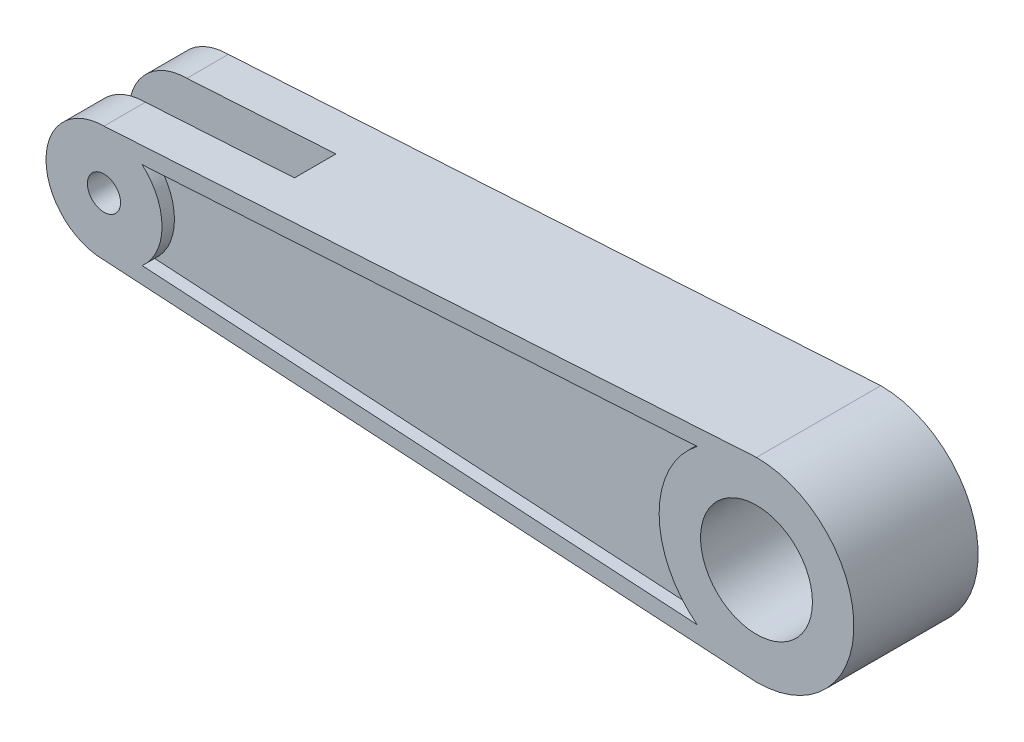
ISO-10303-21;
HEADER;
FILE_DESCRIPTION(('STEP AP214'),'2;1');
FILE_NAME('part.step','',(''),(''),'','','');
FILE_SCHEMA(('AUTOMOTIVE_DESIGN { 1 0 10303 214 1 1 1 1 }'));
ENDSEC;
DATA;
#1=APPLICATION_CONTEXT('core data for automotive mechanical design processes');
#2=APPLICATION_PROTOCOL_DEFINITION('international standard','automotive_design',2000,#1);
#3=PRODUCT_CONTEXT('',#1,'mechanical');
#4=PRODUCT('Part','Part','',(#3));
#5=PRODUCT_RELATED_PRODUCT_CATEGORY('part','',(#4));
#6=PRODUCT_DEFINITION_FORMATION('','',#4);
#7=PRODUCT_DEFINITION_CONTEXT('part definition',#1,'design');
#8=PRODUCT_DEFINITION('design','',#6,#7);
#9=PRODUCT_DEFINITION_SHAPE('','',#8);
#10=(LENGTH_UNIT() NAMED_UNIT(*) SI_UNIT(.MILLI.,.METRE.));
#11=(NAMED_UNIT(*) PLANE_ANGLE_UNIT() SI_UNIT($,.RADIAN.));
#12=(NAMED_UNIT(*) SI_UNIT($,.STERADIAN.) SOLID_ANGLE_UNIT());
#13=UNCERTAINTY_MEASURE_WITH_UNIT(LENGTH_MEASURE(1.E-05),#10,'distance_accuracy_value','');
#14=(GEOMETRIC_REPRESENTATION_CONTEXT(3) GLOBAL_UNCERTAINTY_ASSIGNED_CONTEXT((#13)) GLOBAL_UNIT_ASSIGNED_CONTEXT((#10,
#11,#12)) REPRESENTATION_CONTEXT('',''));
#15=CARTESIAN_POINT('',(0.,0.,0.));
#16=DIRECTION('',(0.,0.,1.));
#17=DIRECTION('',(1.,0.,0.));
#18=AXIS2_PLACEMENT_3D('',#15,#16,#17);
#19=CARTESIAN_POINT('',(-23.5,0.,30.));
#20=DIRECTION('',(0.,0.,1.));
#21=DIRECTION('',(1.,0.,0.));
#22=AXIS2_PLACEMENT_3D('',#19,#20,#21);
#23=PLANE('',#22);
#24=DIRECTION('',(0.998185506003951,0.0602137492906468,0.));
#25=VECTOR('',#24,1.);
#26=CARTESIAN_POINT('',(-23.5,23.5,30.));
#27=LINE('',#26,#25);
#28=CARTESIAN_POINT('',(-180.985,14.,30.));
#29=VERTEX_POINT('',#28);
#30=CARTESIAN_POINT('',(-23.5,23.5,30.));
#31=VERTEX_POINT('',#30);
#32=EDGE_CURVE('E254',#29,#31,#27,.T.);
#33=ORIENTED_EDGE('',*,*,#32,.F.);
#34=CARTESIAN_POINT('',(-180.985,0.,30.));
#35=DIRECTION('',(0.,0.,1.));
#36=DIRECTION('',(-1.,0.,0.));
#37=AXIS2_PLACEMENT_3D('',#34,#35,#36);
#38=CIRCLE('',#37,14.);
#39=CARTESIAN_POINT('',(-180.985,-14.,30.));
#40=VERTEX_POINT('',#39);
#41=EDGE_CURVE('E276',#29,#40,#38,.T.);
#42=ORIENTED_EDGE('',*,*,#41,.T.);
#43=DIRECTION('',(0.998185506003951,-0.0602137492906468,0.));
#44=VECTOR('',#43,1.);
#45=CARTESIAN_POINT('',(-23.5,-23.5,30.));
#46=LINE('',#45,#44);
#47=CARTESIAN_POINT('',(-23.5,-23.5,30.));
#48=VERTEX_POINT('',#47);
#49=EDGE_CURVE('E278',#40,#48,#46,.T.);
#50=ORIENTED_EDGE('',*,*,#49,.T.);
#51=CARTESIAN_POINT('',(-23.5,0.,30.));
#52=DIRECTION('',(0.,0.,1.));
#53=DIRECTION('',(1.,0.,0.));
#54=AXIS2_PLACEMENT_3D('',#51,#52,#53);
#55=CIRCLE('',#54,23.5);
#56=EDGE_CURVE('E267',#48,#31,#55,.T.);
#57=ORIENTED_EDGE('',*,*,#56,.T.);
#58=EDGE_LOOP('',(#33,#42,#50,#57));
#59=FACE_BOUND('',#58,.T.);
#60=CARTESIAN_POINT('',(-180.985,0.,30.));
#61=DIRECTION('',(0.,0.,-1.));
#62=DIRECTION('',(-1.,0.,0.));
#63=AXIS2_PLACEMENT_3D('',#60,#61,#62);
#64=CIRCLE('',#63,4.);
#65=CARTESIAN_POINT('',(-184.985,0.,30.));
#66=VERTEX_POINT('',#65);
#67=EDGE_CURVE('E273',#66,#66,#64,.T.);
#68=ORIENTED_EDGE('',*,*,#67,.T.);
#69=EDGE_LOOP('',(#68));
#70=FACE_BOUND('',#69,.T.);
#71=CARTESIAN_POINT('',(-23.5,0.,30.));
#72=DIRECTION('',(0.,0.,-1.));
#73=DIRECTION('',(1.,0.,0.));
#74=AXIS2_PLACEMENT_3D('',#71,#72,#73);
#75=CIRCLE('',#74,13.5);
#76=CARTESIAN_POINT('',(-10.,0.,30.));
#77=VERTEX_POINT('',#76);
#78=EDGE_CURVE('E269',#77,#77,#75,.T.);
#79=ORIENTED_EDGE('',*,*,#78,.T.);
#80=EDGE_LOOP('',(#79));
#81=FACE_BOUND('',#80,.T.);
#82=DIRECTION('',(0.998185506003951,-0.0602137492906469,0.));
#83=VECTOR('',#82,1.);
#84=CARTESIAN_POINT('',(-171.779614490805,-10.5480271912384,30.));
#85=LINE('',#84,#83);
#86=CARTESIAN_POINT('',(-171.779614490805,-10.5480271912384,30.));
#87=VERTEX_POINT('',#86);
#88=CARTESIAN_POINT('',(-37.8257452683275,-18.6285539564131,30.));
#89=VERTEX_POINT('',#88);
#90=EDGE_CURVE('E197',#87,#89,#85,.T.);
#91=ORIENTED_EDGE('',*,*,#90,.F.);
#92=CARTESIAN_POINT('',(-180.985,0.,30.));
#93=DIRECTION('',(0.,0.,1.));
#94=DIRECTION('',(1.,0.,0.));
#95=AXIS2_PLACEMENT_3D('',#92,#93,#94);
#96=CIRCLE('',#95,14.);
#97=CARTESIAN_POINT('',(-171.779614490805,10.5480271912384,30.));
#98=VERTEX_POINT('',#97);
#99=EDGE_CURVE('E64',#87,#98,#96,.T.);
#100=ORIENTED_EDGE('',*,*,#99,.T.);
#101=DIRECTION('',(0.998185506003951,0.0602137492906468,0.));
#102=VECTOR('',#101,1.);
#103=CARTESIAN_POINT('',(-171.779614490805,10.5480271912384,30.));
#104=LINE('',#103,#102);
#105=CARTESIAN_POINT('',(-37.8257452683275,18.6285539564131,30.));
#106=VERTEX_POINT('',#105);
#107=EDGE_CURVE('E206',#98,#106,#104,.T.);
#108=ORIENTED_EDGE('',*,*,#107,.T.);
#109=CARTESIAN_POINT('',(-23.5,0.,30.));
#110=DIRECTION('',(0.,0.,1.));
#111=DIRECTION('',(1.,0.,0.));
#112=AXIS2_PLACEMENT_3D('',#109,#110,#111);
#113=CIRCLE('',#112,23.5);
#114=EDGE_CURVE('E209',#106,#89,#113,.T.);
#115=ORIENTED_EDGE('',*,*,#114,.T.);
#116=EDGE_LOOP('',(#91,#100,#108,#115));
#117=FACE_BOUND('',#116,.T.);
#118=ADVANCED_FACE('F41',(#59,#70,#81,#117),#23,.T.);
#119=CARTESIAN_POINT('',(-180.985,0.,30.));
#120=DIRECTION('',(0.,0.,-1.));
#121=DIRECTION('',(-1.,0.,0.));
#122=AXIS2_PLACEMENT_3D('',#119,#120,#121);
#123=CYLINDRICAL_SURFACE('',#122,4.);
#124=CARTESIAN_POINT('',(-180.985,0.,0.));
#125=DIRECTION('',(0.,0.,-1.));
#126=DIRECTION('',(-1.,0.,0.));
#127=AXIS2_PLACEMENT_3D('',#124,#125,#126);
#128=CIRCLE('',#127,4.);
#129=CARTESIAN_POINT('',(-184.985,0.,0.));
#130=VERTEX_POINT('',#129);
#131=EDGE_CURVE('E285',#130,#130,#128,.T.);
#132=ORIENTED_EDGE('',*,*,#131,.T.);
#133=EDGE_LOOP('',(#132));
#134=FACE_BOUND('',#133,.T.);
#135=CARTESIAN_POINT('',(-180.985,0.,10.));
#136=DIRECTION('',(0.,0.,1.));
#137=DIRECTION('',(1.,0.,0.));
#138=AXIS2_PLACEMENT_3D('',#135,#136,#137);
#139=CIRCLE('',#138,3.99999999999999);
#140=CARTESIAN_POINT('',(-176.985,0.,10.));
#141=VERTEX_POINT('',#140);
#142=EDGE_CURVE('E221',#141,#141,#139,.T.);
#143=ORIENTED_EDGE('',*,*,#142,.T.);
#144=EDGE_LOOP('',(#143));
#145=FACE_BOUND('',#144,.T.);
#146=ADVANCED_FACE('F346',(#134,#145),#123,.F.);
#147=CARTESIAN_POINT('',(-180.985,0.,30.));
#148=DIRECTION('',(0.,0.,-1.));
#149=DIRECTION('',(-1.,0.,0.));
#150=AXIS2_PLACEMENT_3D('',#147,#148,#149);
#151=CYLINDRICAL_SURFACE('',#150,14.);
#152=CARTESIAN_POINT('',(-180.985,0.,10.));
#153=DIRECTION('',(0.,0.,1.));
#154=DIRECTION('',(1.,0.,0.));
#155=AXIS2_PLACEMENT_3D('',#152,#153,#154);
#156=CIRCLE('',#155,14.);
#157=CARTESIAN_POINT('',(-180.985,14.,10.));
#158=VERTEX_POINT('',#157);
#159=CARTESIAN_POINT('',(-180.985,-14.,10.));
#160=VERTEX_POINT('',#159);
#161=EDGE_CURVE('E224',#158,#160,#156,.T.);
#162=ORIENTED_EDGE('',*,*,#161,.F.);
#163=DIRECTION('',(0.,0.,-1.));
#164=VECTOR('',#163,1.);
#165=CARTESIAN_POINT('',(-180.985,14.,30.));
#166=LINE('',#165,#164);
#167=CARTESIAN_POINT('',(-180.985,14.,0.));
#168=VERTEX_POINT('',#167);
#169=EDGE_CURVE('E257',#158,#168,#166,.T.);
#170=ORIENTED_EDGE('',*,*,#169,.T.);
#171=CARTESIAN_POINT('',(-180.985,0.,0.));
#172=DIRECTION('',(0.,0.,1.));
#173=DIRECTION('',(-1.,0.,0.));
#174=AXIS2_PLACEMENT_3D('',#171,#172,#173);
#175=CIRCLE('',#174,14.);
#176=CARTESIAN_POINT('',(-180.985,-14.,0.));
#177=VERTEX_POINT('',#176);
#178=EDGE_CURVE('E288',#168,#177,#175,.T.);
#179=ORIENTED_EDGE('',*,*,#178,.T.);
#180=DIRECTION('',(0.,0.,-1.));
#181=VECTOR('',#180,1.);
#182=CARTESIAN_POINT('',(-180.985,-14.,30.));
#183=LINE('',#182,#181);
#184=EDGE_CURVE('E49',#160,#177,#183,.T.);
#185=ORIENTED_EDGE('',*,*,#184,.F.);
#186=EDGE_LOOP('',(#162,#170,#179,#185));
#187=FACE_BOUND('',#186,.T.);
#188=ADVANCED_FACE('F304',(#187),#151,.T.);
#189=CARTESIAN_POINT('',(-23.5,0.,30.));
#190=DIRECTION('',(0.,0.,-1.));
#191=DIRECTION('',(-1.,0.,0.));
#192=AXIS2_PLACEMENT_3D('',#189,#190,#191);
#193=CYLINDRICAL_SURFACE('',#192,23.5);
#194=CARTESIAN_POINT('',(-23.5,0.,0.));
#195=DIRECTION('',(0.,0.,1.));
#196=DIRECTION('',(1.,0.,0.));
#197=AXIS2_PLACEMENT_3D('',#194,#195,#196);
#198=CIRCLE('',#197,23.5);
#199=CARTESIAN_POINT('',(-23.5,-23.5,0.));
#200=VERTEX_POINT('',#199);
#201=CARTESIAN_POINT('',(-23.5,23.5,0.));
#202=VERTEX_POINT('',#201);
#203=EDGE_CURVE('E266',#200,#202,#198,.T.);
#204=ORIENTED_EDGE('',*,*,#203,.T.);
#205=DIRECTION('',(0.,0.,-1.));
#206=VECTOR('',#205,1.);
#207=CARTESIAN_POINT('',(-23.5,23.5,30.));
#208=LINE('',#207,#206);
#209=EDGE_CURVE('E263',#31,#202,#208,.T.);
#210=ORIENTED_EDGE('',*,*,#209,.F.);
#211=ORIENTED_EDGE('',*,*,#56,.F.);
#212=DIRECTION('',(0.,0.,-1.));
#213=VECTOR('',#212,1.);
#214=CARTESIAN_POINT('',(-23.5,-23.5,30.));
#215=LINE('',#214,#213);
#216=EDGE_CURVE('E280',#48,#200,#215,.T.);
#217=ORIENTED_EDGE('',*,*,#216,.T.);
#218=EDGE_LOOP('',(#204,#210,#211,#217));
#219=FACE_BOUND('',#218,.T.);
#220=ADVANCED_FACE('F43',(#219),#193,.T.);
#221=CARTESIAN_POINT('',(-23.5,0.,30.));
#222=DIRECTION('',(0.,0.,-1.));
#223=DIRECTION('',(-1.,0.,0.));
#224=AXIS2_PLACEMENT_3D('',#221,#222,#223);
#225=CYLINDRICAL_SURFACE('',#224,13.5);
#226=CARTESIAN_POINT('',(-23.5,0.,0.));
#227=DIRECTION('',(0.,0.,-1.));
#228=DIRECTION('',(1.,0.,0.));
#229=AXIS2_PLACEMENT_3D('',#226,#227,#228);
#230=CIRCLE('',#229,13.5);
#231=CARTESIAN_POINT('',(-10.,0.,0.));
#232=VERTEX_POINT('',#231);
#233=EDGE_CURVE('E282',#232,#232,#230,.T.);
#234=ORIENTED_EDGE('',*,*,#233,.T.);
#235=EDGE_LOOP('',(#234));
#236=FACE_BOUND('',#235,.T.);
#237=ORIENTED_EDGE('',*,*,#78,.F.);
#238=EDGE_LOOP('',(#237));
#239=FACE_BOUND('',#238,.T.);
#240=ADVANCED_FACE('F363',(#236,#239),#225,.F.);
#241=CARTESIAN_POINT('',(-180.985,0.,20.));
#242=DIRECTION('',(0.,0.,1.));
#243=DIRECTION('',(1.,0.,0.));
#244=AXIS2_PLACEMENT_3D('',#241,#242,#243);
#245=CIRCLE('',#244,3.99999999999999);
#246=CARTESIAN_POINT('',(-176.985,0.,20.));
#247=VERTEX_POINT('',#246);
#248=EDGE_CURVE('E233',#247,#247,#245,.T.);
#249=ORIENTED_EDGE('',*,*,#248,.F.);
#250=EDGE_LOOP('',(#249));
#251=FACE_BOUND('',#250,.T.);
#252=ORIENTED_EDGE('',*,*,#67,.F.);
#253=EDGE_LOOP('',(#252));
#254=FACE_BOUND('',#253,.T.);
#255=ADVANCED_FACE('F353',(#251,#254),#123,.F.);
#256=CARTESIAN_POINT('',(-180.985,14.,20.));
#257=VERTEX_POINT('',#256);
#258=EDGE_CURVE('E260',#29,#257,#166,.T.);
#259=ORIENTED_EDGE('',*,*,#258,.T.);
#260=CARTESIAN_POINT('',(-180.985,0.,20.));
#261=DIRECTION('',(0.,0.,1.));
#262=DIRECTION('',(1.,0.,0.));
#263=AXIS2_PLACEMENT_3D('',#260,#261,#262);
#264=CIRCLE('',#263,14.);
#265=CARTESIAN_POINT('',(-180.985,-14.,20.));
#266=VERTEX_POINT('',#265);
#267=EDGE_CURVE('E236',#257,#266,#264,.T.);
#268=ORIENTED_EDGE('',*,*,#267,.T.);
#269=EDGE_CURVE('E11',#40,#266,#183,.T.);
#270=ORIENTED_EDGE('',*,*,#269,.F.);
#271=ORIENTED_EDGE('',*,*,#41,.F.);
#272=EDGE_LOOP('',(#259,#268,#270,#271));
#273=FACE_BOUND('',#272,.T.);
#274=ADVANCED_FACE('F320',(#273),#151,.T.);
#275=CARTESIAN_POINT('',(-23.5,-23.5,30.));
#276=DIRECTION('',(0.0602137492906468,0.998185506003951,0.));
#277=DIRECTION('',(-0.998185506003951,0.0602137492906468,0.));
#278=AXIS2_PLACEMENT_3D('',#275,#276,#277);
#279=PLANE('',#278);
#280=ORIENTED_EDGE('',*,*,#269,.T.);
#281=DIRECTION('',(0.998185506003951,-0.0602137492906468,0.));
#282=VECTOR('',#281,1.);
#283=CARTESIAN_POINT('',(-180.985,-14.,20.));
#284=LINE('',#283,#282);
#285=CARTESIAN_POINT('',(-145.01626046434,-16.1697496624362,20.));
#286=VERTEX_POINT('',#285);
#287=EDGE_CURVE('E239',#266,#286,#284,.T.);
#288=ORIENTED_EDGE('',*,*,#287,.T.);
#289=DIRECTION('',(0.,0.,-1.));
#290=VECTOR('',#289,1.);
#291=CARTESIAN_POINT('',(-145.01626046434,-16.1697496624362,20.));
#292=LINE('',#291,#290);
#293=CARTESIAN_POINT('',(-145.01626046434,-16.1697496624362,10.));
#294=VERTEX_POINT('',#293);
#295=EDGE_CURVE('E250',#286,#294,#292,.T.);
#296=ORIENTED_EDGE('',*,*,#295,.T.);
#297=DIRECTION('',(0.998185506003951,-0.0602137492906468,0.));
#298=VECTOR('',#297,1.);
#299=CARTESIAN_POINT('',(-180.985,-14.,10.));
#300=LINE('',#299,#298);
#301=EDGE_CURVE('E226',#160,#294,#300,.T.);
#302=ORIENTED_EDGE('',*,*,#301,.F.);
#303=ORIENTED_EDGE('',*,*,#184,.T.);
#304=DIRECTION('',(0.998185506003951,-0.0602137492906468,0.));
#305=VECTOR('',#304,1.);
#306=CARTESIAN_POINT('',(-23.5,-23.5,0.));
#307=LINE('',#306,#305);
#308=EDGE_CURVE('E270',#177,#200,#307,.T.);
#309=ORIENTED_EDGE('',*,*,#308,.T.);
#310=ORIENTED_EDGE('',*,*,#216,.F.);
#311=ORIENTED_EDGE('',*,*,#49,.F.);
#312=EDGE_LOOP('',(#280,#288,#296,#302,#303,#309,#310,#311));
#313=FACE_BOUND('',#312,.T.);
#314=ADVANCED_FACE('F299',(#313),#279,.F.);
#315=CARTESIAN_POINT('',(-23.5,0.,0.));
#316=DIRECTION('',(0.,0.,1.));
#317=DIRECTION('',(1.,0.,0.));
#318=AXIS2_PLACEMENT_3D('',#315,#316,#317);
#319=PLANE('',#318);
#320=DIRECTION('',(0.998185506003951,0.0602137492906468,0.));
#321=VECTOR('',#320,1.);
#322=CARTESIAN_POINT('',(-171.779614490805,10.5480271912384,0.));
#323=LINE('',#322,#321);
#324=CARTESIAN_POINT('',(-171.779614490805,10.5480271912384,0.));
#325=VERTEX_POINT('',#324);
#326=CARTESIAN_POINT('',(-37.8257452683275,18.6285539564131,0.));
#327=VERTEX_POINT('',#326);
#328=EDGE_CURVE('E176',#325,#327,#323,.T.);
#329=ORIENTED_EDGE('',*,*,#328,.F.);
#330=CARTESIAN_POINT('',(-180.985,0.,0.));
#331=DIRECTION('',(0.,0.,1.));
#332=DIRECTION('',(1.,0.,0.));
#333=AXIS2_PLACEMENT_3D('',#330,#331,#332);
#334=CIRCLE('',#333,14.);
#335=CARTESIAN_POINT('',(-171.779614490805,-10.5480271912384,0.));
#336=VERTEX_POINT('',#335);
#337=EDGE_CURVE('E56',#336,#325,#334,.T.);
#338=ORIENTED_EDGE('',*,*,#337,.F.);
#339=DIRECTION('',(0.998185506003951,-0.0602137492906469,0.));
#340=VECTOR('',#339,1.);
#341=CARTESIAN_POINT('',(-171.779614490805,-10.5480271912384,0.));
#342=LINE('',#341,#340);
#343=CARTESIAN_POINT('',(-37.8257452683275,-18.6285539564131,0.));
#344=VERTEX_POINT('',#343);
#345=EDGE_CURVE('E160',#336,#344,#342,.T.);
#346=ORIENTED_EDGE('',*,*,#345,.T.);
#347=CARTESIAN_POINT('',(-23.5,0.,0.));
#348=DIRECTION('',(0.,0.,1.));
#349=DIRECTION('',(1.,0.,0.));
#350=AXIS2_PLACEMENT_3D('',#347,#348,#349);
#351=CIRCLE('',#350,23.5);
#352=EDGE_CURVE('E179',#327,#344,#351,.T.);
#353=ORIENTED_EDGE('',*,*,#352,.F.);
#354=EDGE_LOOP('',(#329,#338,#346,#353));
#355=FACE_BOUND('',#354,.T.);
#356=ORIENTED_EDGE('',*,*,#178,.F.);
#357=DIRECTION('',(0.998185506003951,0.0602137492906468,0.));
#358=VECTOR('',#357,1.);
#359=CARTESIAN_POINT('',(-23.5,23.5,0.));
#360=LINE('',#359,#358);
#361=EDGE_CURVE('E253',#168,#202,#360,.T.);
#362=ORIENTED_EDGE('',*,*,#361,.T.);
#363=ORIENTED_EDGE('',*,*,#203,.F.);
#364=ORIENTED_EDGE('',*,*,#308,.F.);
#365=EDGE_LOOP('',(#356,#362,#363,#364));
#366=FACE_BOUND('',#365,.T.);
#367=ORIENTED_EDGE('',*,*,#131,.F.);
#368=EDGE_LOOP('',(#367));
#369=FACE_BOUND('',#368,.T.);
#370=ORIENTED_EDGE('',*,*,#233,.F.);
#371=EDGE_LOOP('',(#370));
#372=FACE_BOUND('',#371,.T.);
#373=ADVANCED_FACE('F308',(#355,#366,#369,#372),#319,.F.);
#374=CARTESIAN_POINT('',(-23.5,23.5,30.));
#375=DIRECTION('',(-0.0602137492906468,0.998185506003951,0.));
#376=DIRECTION('',(-0.998185506003951,-0.0602137492906468,0.));
#377=AXIS2_PLACEMENT_3D('',#374,#375,#376);
#378=PLANE('',#377);
#379=DIRECTION('',(-0.998185506003951,-0.0602137492906463,0.));
#380=VECTOR('',#379,1.);
#381=CARTESIAN_POINT('',(-145.01626046434,16.1697496624362,20.));
#382=LINE('',#381,#380);
#383=CARTESIAN_POINT('',(-145.01626046434,16.1697496624362,20.));
#384=VERTEX_POINT('',#383);
#385=EDGE_CURVE('E244',#384,#257,#382,.T.);
#386=ORIENTED_EDGE('',*,*,#385,.T.);
#387=ORIENTED_EDGE('',*,*,#258,.F.);
#388=ORIENTED_EDGE('',*,*,#32,.T.);
#389=ORIENTED_EDGE('',*,*,#209,.T.);
#390=ORIENTED_EDGE('',*,*,#361,.F.);
#391=ORIENTED_EDGE('',*,*,#169,.F.);
#392=DIRECTION('',(-0.998185506003951,-0.0602137492906463,0.));
#393=VECTOR('',#392,1.);
#394=CARTESIAN_POINT('',(-145.01626046434,16.1697496624362,10.));
#395=LINE('',#394,#393);
#396=CARTESIAN_POINT('',(-145.01626046434,16.1697496624362,10.));
#397=VERTEX_POINT('',#396);
#398=EDGE_CURVE('E231',#397,#158,#395,.T.);
#399=ORIENTED_EDGE('',*,*,#398,.F.);
#400=DIRECTION('',(0.,0.,-1.));
#401=VECTOR('',#400,1.);
#402=CARTESIAN_POINT('',(-145.01626046434,16.1697496624362,20.));
#403=LINE('',#402,#401);
#404=EDGE_CURVE('E247',#384,#397,#403,.T.);
#405=ORIENTED_EDGE('',*,*,#404,.F.);
#406=EDGE_LOOP('',(#386,#387,#388,#389,#390,#391,#399,#405));
#407=FACE_BOUND('',#406,.T.);
#408=ADVANCED_FACE('F312',(#407),#378,.T.);
#409=CARTESIAN_POINT('',(-180.985,0.,20.));
#410=DIRECTION('',(0.,0.,1.));
#411=DIRECTION('',(1.,0.,0.));
#412=AXIS2_PLACEMENT_3D('',#409,#410,#411);
#413=PLANE('',#412);
#414=ORIENTED_EDGE('',*,*,#267,.F.);
#415=ORIENTED_EDGE('',*,*,#385,.F.);
#416=DIRECTION('',(0.,1.,0.));
#417=VECTOR('',#416,1.);
#418=CARTESIAN_POINT('',(-145.01626046434,16.1697496624362,20.));
#419=LINE('',#418,#417);
#420=EDGE_CURVE('E242',#286,#384,#419,.T.);
#421=ORIENTED_EDGE('',*,*,#420,.F.);
#422=ORIENTED_EDGE('',*,*,#287,.F.);
#423=EDGE_LOOP('',(#414,#415,#421,#422));
#424=FACE_BOUND('',#423,.T.);
#425=ORIENTED_EDGE('',*,*,#248,.T.);
#426=EDGE_LOOP('',(#425));
#427=FACE_BOUND('',#426,.T.);
#428=ADVANCED_FACE('F323',(#424,#427),#413,.F.);
#429=CARTESIAN_POINT('',(-145.01626046434,16.1697496624362,20.));
#430=DIRECTION('',(-1.,0.,0.));
#431=DIRECTION('',(0.,0.,1.));
#432=AXIS2_PLACEMENT_3D('',#429,#430,#431);
#433=PLANE('',#432);
#434=ORIENTED_EDGE('',*,*,#295,.F.);
#435=ORIENTED_EDGE('',*,*,#420,.T.);
#436=ORIENTED_EDGE('',*,*,#404,.T.);
#437=DIRECTION('',(0.,1.,0.));
#438=VECTOR('',#437,1.);
#439=CARTESIAN_POINT('',(-145.01626046434,16.1697496624362,10.));
#440=LINE('',#439,#438);
#441=EDGE_CURVE('E229',#294,#397,#440,.T.);
#442=ORIENTED_EDGE('',*,*,#441,.F.);
#443=EDGE_LOOP('',(#434,#435,#436,#442));
#444=FACE_BOUND('',#443,.T.);
#445=ADVANCED_FACE('F329',(#444),#433,.T.);
#446=CARTESIAN_POINT('',(-180.985,0.,10.));
#447=DIRECTION('',(0.,0.,1.));
#448=DIRECTION('',(1.,0.,0.));
#449=AXIS2_PLACEMENT_3D('',#446,#447,#448);
#450=PLANE('',#449);
#451=ORIENTED_EDGE('',*,*,#142,.F.);
#452=EDGE_LOOP('',(#451));
#453=FACE_BOUND('',#452,.T.);
#454=ORIENTED_EDGE('',*,*,#161,.T.);
#455=ORIENTED_EDGE('',*,*,#301,.T.);
#456=ORIENTED_EDGE('',*,*,#441,.T.);
#457=ORIENTED_EDGE('',*,*,#398,.T.);
#458=EDGE_LOOP('',(#454,#455,#456,#457));
#459=FACE_BOUND('',#458,.T.);
#460=ADVANCED_FACE('F331',(#453,#459),#450,.T.);
#461=CARTESIAN_POINT('',(-180.985,0.,27.));
#462=DIRECTION('',(0.,0.,1.));
#463=DIRECTION('',(1.,0.,0.));
#464=AXIS2_PLACEMENT_3D('',#461,#462,#463);
#465=CYLINDRICAL_SURFACE('',#464,14.);
#466=ORIENTED_EDGE('',*,*,#99,.F.);
#467=DIRECTION('',(0.,0.,1.));
#468=VECTOR('',#467,1.);
#469=CARTESIAN_POINT('',(-171.779614490805,-10.5480271912384,27.));
#470=LINE('',#469,#468);
#471=CARTESIAN_POINT('',(-171.779614490805,-10.5480271912384,27.));
#472=VERTEX_POINT('',#471);
#473=EDGE_CURVE('E204',#472,#87,#470,.T.);
#474=ORIENTED_EDGE('',*,*,#473,.F.);
#475=CARTESIAN_POINT('',(-180.985,0.,27.));
#476=DIRECTION('',(0.,0.,1.));
#477=DIRECTION('',(1.,0.,0.));
#478=AXIS2_PLACEMENT_3D('',#475,#476,#477);
#479=CIRCLE('',#478,14.);
#480=CARTESIAN_POINT('',(-171.779614490805,10.5480271912384,27.));
#481=VERTEX_POINT('',#480);
#482=EDGE_CURVE('E193',#472,#481,#479,.T.);
#483=ORIENTED_EDGE('',*,*,#482,.T.);
#484=DIRECTION('',(0.,0.,1.));
#485=VECTOR('',#484,1.);
#486=CARTESIAN_POINT('',(-171.779614490805,10.5480271912384,27.));
#487=LINE('',#486,#485);
#488=EDGE_CURVE('E219',#481,#98,#487,.T.);
#489=ORIENTED_EDGE('',*,*,#488,.T.);
#490=EDGE_LOOP('',(#466,#474,#483,#489));
#491=FACE_BOUND('',#490,.T.);
#492=ADVANCED_FACE('F333',(#491),#465,.T.);
#493=CARTESIAN_POINT('',(-171.779614490805,10.5480271912384,27.));
#494=DIRECTION('',(0.0602137492906468,-0.998185506003951,0.));
#495=DIRECTION('',(0.998185506003951,0.0602137492906468,0.));
#496=AXIS2_PLACEMENT_3D('',#493,#494,#495);
#497=PLANE('',#496);
#498=ORIENTED_EDGE('',*,*,#107,.F.);
#499=ORIENTED_EDGE('',*,*,#488,.F.);
#500=DIRECTION('',(0.998185506003951,0.0602137492906468,0.));
#501=VECTOR('',#500,1.);
#502=CARTESIAN_POINT('',(-171.779614490805,10.5480271912384,27.));
#503=LINE('',#502,#501);
#504=CARTESIAN_POINT('',(-37.8257452683275,18.6285539564131,27.));
#505=VERTEX_POINT('',#504);
#506=EDGE_CURVE('E196',#481,#505,#503,.T.);
#507=ORIENTED_EDGE('',*,*,#506,.T.);
#508=DIRECTION('',(0.,0.,1.));
#509=VECTOR('',#508,1.);
#510=CARTESIAN_POINT('',(-37.8257452683275,18.6285539564131,27.));
#511=LINE('',#510,#509);
#512=EDGE_CURVE('E217',#505,#106,#511,.T.);
#513=ORIENTED_EDGE('',*,*,#512,.T.);
#514=EDGE_LOOP('',(#498,#499,#507,#513));
#515=FACE_BOUND('',#514,.T.);
#516=ADVANCED_FACE('F341',(#515),#497,.T.);
#517=CARTESIAN_POINT('',(-23.5,0.,27.));
#518=DIRECTION('',(0.,0.,1.));
#519=DIRECTION('',(1.,0.,0.));
#520=AXIS2_PLACEMENT_3D('',#517,#518,#519);
#521=CYLINDRICAL_SURFACE('',#520,23.5);
#522=ORIENTED_EDGE('',*,*,#114,.F.);
#523=ORIENTED_EDGE('',*,*,#512,.F.);
#524=CARTESIAN_POINT('',(-23.5,0.,27.));
#525=DIRECTION('',(0.,0.,1.));
#526=DIRECTION('',(1.,0.,0.));
#527=AXIS2_PLACEMENT_3D('',#524,#525,#526);
#528=CIRCLE('',#527,23.5);
#529=CARTESIAN_POINT('',(-37.8257452683275,-18.6285539564131,27.));
#530=VERTEX_POINT('',#529);
#531=EDGE_CURVE('E199',#505,#530,#528,.T.);
#532=ORIENTED_EDGE('',*,*,#531,.T.);
#533=DIRECTION('',(0.,0.,1.));
#534=VECTOR('',#533,1.);
#535=CARTESIAN_POINT('',(-37.8257452683275,-18.6285539564131,27.));
#536=LINE('',#535,#534);
#537=EDGE_CURVE('E215',#530,#89,#536,.T.);
#538=ORIENTED_EDGE('',*,*,#537,.T.);
#539=EDGE_LOOP('',(#522,#523,#532,#538));
#540=FACE_BOUND('',#539,.T.);
#541=ADVANCED_FACE('F389',(#540),#521,.T.);
#542=CARTESIAN_POINT('',(-171.779614490805,-10.5480271912384,27.));
#543=DIRECTION('',(-0.0602137492906469,-0.998185506003951,0.));
#544=DIRECTION('',(0.998185506003951,-0.0602137492906469,0.));
#545=AXIS2_PLACEMENT_3D('',#542,#543,#544);
#546=PLANE('',#545);
#547=ORIENTED_EDGE('',*,*,#90,.T.);
#548=ORIENTED_EDGE('',*,*,#537,.F.);
#549=DIRECTION('',(0.998185506003951,-0.0602137492906469,0.));
#550=VECTOR('',#549,1.);
#551=CARTESIAN_POINT('',(-171.779614490805,-10.5480271912384,27.));
#552=LINE('',#551,#550);
#553=EDGE_CURVE('E201',#472,#530,#552,.T.);
#554=ORIENTED_EDGE('',*,*,#553,.F.);
#555=ORIENTED_EDGE('',*,*,#473,.T.);
#556=EDGE_LOOP('',(#547,#548,#554,#555));
#557=FACE_BOUND('',#556,.T.);
#558=ADVANCED_FACE('F379',(#557),#546,.F.);
#559=CARTESIAN_POINT('',(-180.985,0.,27.));
#560=DIRECTION('',(0.,0.,1.));
#561=DIRECTION('',(1.,0.,0.));
#562=AXIS2_PLACEMENT_3D('',#559,#560,#561);
#563=PLANE('',#562);
#564=ORIENTED_EDGE('',*,*,#482,.F.);
#565=ORIENTED_EDGE('',*,*,#553,.T.);
#566=ORIENTED_EDGE('',*,*,#531,.F.);
#567=ORIENTED_EDGE('',*,*,#506,.F.);
#568=EDGE_LOOP('',(#564,#565,#566,#567));
#569=FACE_BOUND('',#568,.T.);
#570=ADVANCED_FACE('F384',(#569),#563,.T.);
#571=CARTESIAN_POINT('',(-180.985,0.,3.));
#572=DIRECTION('',(0.,0.,-1.));
#573=DIRECTION('',(-1.,0.,0.));
#574=AXIS2_PLACEMENT_3D('',#571,#572,#573);
#575=CYLINDRICAL_SURFACE('',#574,14.);
#576=ORIENTED_EDGE('',*,*,#337,.T.);
#577=DIRECTION('',(0.,0.,-1.));
#578=VECTOR('',#577,1.);
#579=CARTESIAN_POINT('',(-171.779614490805,10.5480271912384,3.));
#580=LINE('',#579,#578);
#581=CARTESIAN_POINT('',(-171.779614490805,10.5480271912384,3.));
#582=VERTEX_POINT('',#581);
#583=EDGE_CURVE('E175',#582,#325,#580,.T.);
#584=ORIENTED_EDGE('',*,*,#583,.F.);
#585=CARTESIAN_POINT('',(-180.985,0.,3.));
#586=DIRECTION('',(0.,0.,1.));
#587=DIRECTION('',(1.,0.,0.));
#588=AXIS2_PLACEMENT_3D('',#585,#586,#587);
#589=CIRCLE('',#588,14.);
#590=CARTESIAN_POINT('',(-171.779614490805,-10.5480271912384,3.));
#591=VERTEX_POINT('',#590);
#592=EDGE_CURVE('E169',#591,#582,#589,.T.);
#593=ORIENTED_EDGE('',*,*,#592,.F.);
#594=DIRECTION('',(0.,0.,-1.));
#595=VECTOR('',#594,1.);
#596=CARTESIAN_POINT('',(-171.779614490805,-10.5480271912384,3.));
#597=LINE('',#596,#595);
#598=EDGE_CURVE('E154',#591,#336,#597,.T.);
#599=ORIENTED_EDGE('',*,*,#598,.T.);
#600=EDGE_LOOP('',(#576,#584,#593,#599));
#601=FACE_BOUND('',#600,.T.);
#602=ADVANCED_FACE('F174',(#601),#575,.T.);
#603=CARTESIAN_POINT('',(-171.779614490805,-10.5480271912384,3.));
#604=DIRECTION('',(0.0602137492906469,0.998185506003951,0.));
#605=DIRECTION('',(-0.998185506003951,0.0602137492906469,0.));
#606=AXIS2_PLACEMENT_3D('',#603,#604,#605);
#607=PLANE('',#606);
#608=ORIENTED_EDGE('',*,*,#345,.F.);
#609=ORIENTED_EDGE('',*,*,#598,.F.);
#610=DIRECTION('',(0.998185506003951,-0.0602137492906469,0.));
#611=VECTOR('',#610,1.);
#612=CARTESIAN_POINT('',(-171.779614490805,-10.5480271912384,3.));
#613=LINE('',#612,#611);
#614=CARTESIAN_POINT('',(-37.8257452683275,-18.6285539564131,3.));
#615=VERTEX_POINT('',#614);
#616=EDGE_CURVE('E157',#591,#615,#613,.T.);
#617=ORIENTED_EDGE('',*,*,#616,.T.);
#618=DIRECTION('',(0.,0.,-1.));
#619=VECTOR('',#618,1.);
#620=CARTESIAN_POINT('',(-37.8257452683275,-18.6285539564131,3.));
#621=LINE('',#620,#619);
#622=EDGE_CURVE('E162',#615,#344,#621,.T.);
#623=ORIENTED_EDGE('',*,*,#622,.T.);
#624=EDGE_LOOP('',(#608,#609,#617,#623));
#625=FACE_BOUND('',#624,.T.);
#626=ADVANCED_FACE('F156',(#625),#607,.T.);
#627=CARTESIAN_POINT('',(-23.5,0.,3.));
#628=DIRECTION('',(0.,0.,-1.));
#629=DIRECTION('',(-1.,0.,0.));
#630=AXIS2_PLACEMENT_3D('',#627,#628,#629);
#631=CYLINDRICAL_SURFACE('',#630,23.5);
#632=ORIENTED_EDGE('',*,*,#352,.T.);
#633=ORIENTED_EDGE('',*,*,#622,.F.);
#634=CARTESIAN_POINT('',(-23.5,0.,3.));
#635=DIRECTION('',(0.,0.,1.));
#636=DIRECTION('',(1.,0.,0.));
#637=AXIS2_PLACEMENT_3D('',#634,#635,#636);
#638=CIRCLE('',#637,23.5);
#639=CARTESIAN_POINT('',(-37.8257452683275,18.6285539564131,3.));
#640=VERTEX_POINT('',#639);
#641=EDGE_CURVE('E172',#640,#615,#638,.T.);
#642=ORIENTED_EDGE('',*,*,#641,.F.);
#643=DIRECTION('',(0.,0.,-1.));
#644=VECTOR('',#643,1.);
#645=CARTESIAN_POINT('',(-37.8257452683275,18.6285539564131,3.));
#646=LINE('',#645,#644);
#647=EDGE_CURVE('E190',#640,#327,#646,.T.);
#648=ORIENTED_EDGE('',*,*,#647,.T.);
#649=EDGE_LOOP('',(#632,#633,#642,#648));
#650=FACE_BOUND('',#649,.T.);
#651=ADVANCED_FACE('F405',(#650),#631,.T.);
#652=CARTESIAN_POINT('',(-171.779614490805,10.5480271912384,3.));
#653=DIRECTION('',(-0.0602137492906468,0.998185506003951,0.));
#654=DIRECTION('',(-0.998185506003951,-0.0602137492906468,0.));
#655=AXIS2_PLACEMENT_3D('',#652,#653,#654);
#656=PLANE('',#655);
#657=ORIENTED_EDGE('',*,*,#328,.T.);
#658=ORIENTED_EDGE('',*,*,#647,.F.);
#659=DIRECTION('',(0.998185506003951,0.0602137492906468,0.));
#660=VECTOR('',#659,1.);
#661=CARTESIAN_POINT('',(-171.779614490805,10.5480271912384,3.));
#662=LINE('',#661,#660);
#663=EDGE_CURVE('E183',#582,#640,#662,.T.);
#664=ORIENTED_EDGE('',*,*,#663,.F.);
#665=ORIENTED_EDGE('',*,*,#583,.T.);
#666=EDGE_LOOP('',(#657,#658,#664,#665));
#667=FACE_BOUND('',#666,.T.);
#668=ADVANCED_FACE('F408',(#667),#656,.F.);
#669=CARTESIAN_POINT('',(-180.985,0.,3.));
#670=DIRECTION('',(0.,0.,-1.));
#671=DIRECTION('',(1.,0.,0.));
#672=AXIS2_PLACEMENT_3D('',#669,#670,#671);
#673=PLANE('',#672);
#674=ORIENTED_EDGE('',*,*,#592,.T.);
#675=ORIENTED_EDGE('',*,*,#663,.T.);
#676=ORIENTED_EDGE('',*,*,#641,.T.);
#677=ORIENTED_EDGE('',*,*,#616,.F.);
#678=EDGE_LOOP('',(#674,#675,#676,#677));
#679=FACE_BOUND('',#678,.T.);
#680=ADVANCED_FACE('F167',(#679),#673,.T.);
#681=CLOSED_SHELL('',(#118,#146,#188,#220,#240,#255,#274,#314,#373,#408,#428,#445,#460,#492,
#516,#541,#558,#570,#602,#626,#651,#668,#680));
#682=MANIFOLD_SOLID_BREP('B2',#681);
#683=ADVANCED_BREP_SHAPE_REPRESENTATION('',(#18,#682),#14);
#684=SHAPE_DEFINITION_REPRESENTATION(#9,#683);
ENDSEC;
END-ISO-10303-21;
